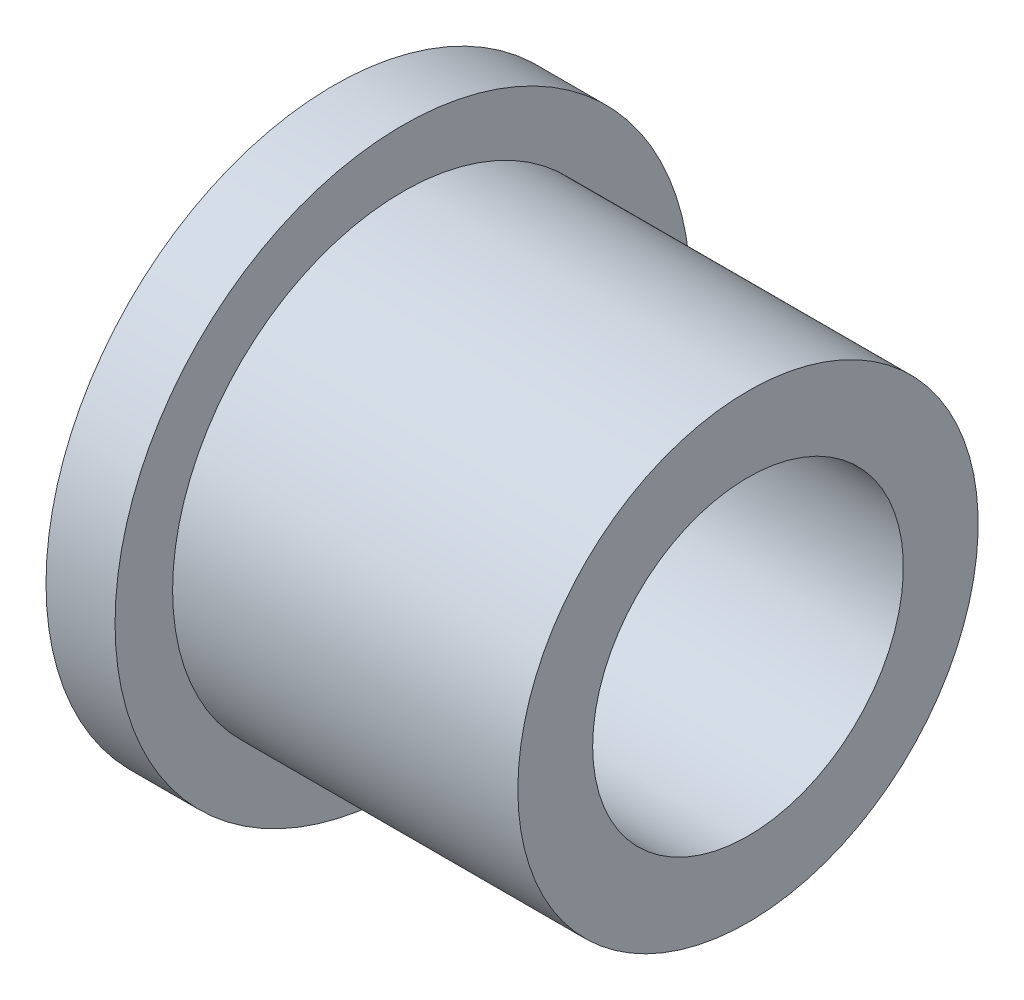
ISO-10303-21;
HEADER;
FILE_DESCRIPTION(('STEP AP214'),'2;1');
FILE_NAME('part.step','',(''),(''),'','','');
FILE_SCHEMA(('AUTOMOTIVE_DESIGN { 1 0 10303 214 1 1 1 1 }'));
ENDSEC;
DATA;
#1=APPLICATION_CONTEXT('core data for automotive mechanical design processes');
#2=APPLICATION_PROTOCOL_DEFINITION('international standard','automotive_design',2000,#1);
#3=PRODUCT_CONTEXT('',#1,'mechanical');
#4=PRODUCT('Part','Part','',(#3));
#5=PRODUCT_RELATED_PRODUCT_CATEGORY('part','',(#4));
#6=PRODUCT_DEFINITION_FORMATION('','',#4);
#7=PRODUCT_DEFINITION_CONTEXT('part definition',#1,'design');
#8=PRODUCT_DEFINITION('design','',#6,#7);
#9=PRODUCT_DEFINITION_SHAPE('','',#8);
#10=(LENGTH_UNIT() NAMED_UNIT(*) SI_UNIT(.MILLI.,.METRE.));
#11=(NAMED_UNIT(*) PLANE_ANGLE_UNIT() SI_UNIT($,.RADIAN.));
#12=(NAMED_UNIT(*) SI_UNIT($,.STERADIAN.) SOLID_ANGLE_UNIT());
#13=UNCERTAINTY_MEASURE_WITH_UNIT(LENGTH_MEASURE(1.E-05),#10,'distance_accuracy_value','');
#14=(GEOMETRIC_REPRESENTATION_CONTEXT(3) GLOBAL_UNCERTAINTY_ASSIGNED_CONTEXT((#13)) GLOBAL_UNIT_ASSIGNED_CONTEXT((#10,
#11,#12)) REPRESENTATION_CONTEXT('',''));
#15=CARTESIAN_POINT('',(0.,0.,0.));
#16=DIRECTION('',(0.,0.,1.));
#17=DIRECTION('',(1.,0.,0.));
#18=AXIS2_PLACEMENT_3D('',#15,#16,#17);
#19=CARTESIAN_POINT('',(-30.377027027027,0.,0.));
#20=DIRECTION('',(-1.,0.,0.));
#21=DIRECTION('',(0.,0.,1.));
#22=AXIS2_PLACEMENT_3D('',#19,#20,#21);
#23=CYLINDRICAL_SURFACE('',#22,8.5725);
#24=CARTESIAN_POINT('',(0.,0.,0.));
#25=DIRECTION('',(-1.,0.,0.));
#26=DIRECTION('',(0.,0.,1.));
#27=AXIS2_PLACEMENT_3D('',#24,#25,#26);
#28=CIRCLE('',#27,8.5725);
#29=CARTESIAN_POINT('',(0.,0.,8.5725));
#30=VERTEX_POINT('',#29);
#31=EDGE_CURVE('E10',#30,#30,#28,.T.);
#32=ORIENTED_EDGE('',*,*,#31,.F.);
#33=EDGE_LOOP('',(#32));
#34=FACE_BOUND('',#33,.T.);
#35=CARTESIAN_POINT('',(-22.86,0.,0.));
#36=DIRECTION('',(-1.,0.,0.));
#37=DIRECTION('',(0.,0.,1.));
#38=AXIS2_PLACEMENT_3D('',#35,#36,#37);
#39=CIRCLE('',#38,8.5725);
#40=CARTESIAN_POINT('',(-22.86,0.,8.5725));
#41=VERTEX_POINT('',#40);
#42=EDGE_CURVE('E68',#41,#41,#39,.T.);
#43=ORIENTED_EDGE('',*,*,#42,.T.);
#44=EDGE_LOOP('',(#43));
#45=FACE_BOUND('',#44,.T.);
#46=ADVANCED_FACE('F41',(#34,#45),#23,.F.);
#47=CARTESIAN_POINT('',(0.,8.5725,0.));
#48=DIRECTION('',(-1.,0.,0.));
#49=DIRECTION('',(0.,0.,1.));
#50=AXIS2_PLACEMENT_3D('',#47,#48,#49);
#51=PLANE('',#50);
#52=CARTESIAN_POINT('',(0.,0.,0.));
#53=DIRECTION('',(-1.,0.,0.));
#54=DIRECTION('',(0.,0.,1.));
#55=AXIS2_PLACEMENT_3D('',#52,#53,#54);
#56=CIRCLE('',#55,12.7);
#57=CARTESIAN_POINT('',(0.,0.,12.7));
#58=VERTEX_POINT('',#57);
#59=EDGE_CURVE('E48',#58,#58,#56,.T.);
#60=ORIENTED_EDGE('',*,*,#59,.F.);
#61=EDGE_LOOP('',(#60));
#62=FACE_BOUND('',#61,.T.);
#63=ORIENTED_EDGE('',*,*,#31,.T.);
#64=EDGE_LOOP('',(#63));
#65=FACE_BOUND('',#64,.T.);
#66=ADVANCED_FACE('F94',(#62,#65),#51,.F.);
#67=CARTESIAN_POINT('',(-30.377027027027,0.,0.));
#68=DIRECTION('',(-1.,0.,0.));
#69=DIRECTION('',(0.,0.,1.));
#70=AXIS2_PLACEMENT_3D('',#67,#68,#69);
#71=CYLINDRICAL_SURFACE('',#70,12.7);
#72=CARTESIAN_POINT('',(-19.05,0.,0.));
#73=DIRECTION('',(-1.,0.,0.));
#74=DIRECTION('',(0.,0.,1.));
#75=AXIS2_PLACEMENT_3D('',#72,#73,#74);
#76=CIRCLE('',#75,12.7);
#77=CARTESIAN_POINT('',(-19.05,0.,12.7));
#78=VERTEX_POINT('',#77);
#79=EDGE_CURVE('E53',#78,#78,#76,.T.);
#80=ORIENTED_EDGE('',*,*,#79,.F.);
#81=EDGE_LOOP('',(#80));
#82=FACE_BOUND('',#81,.T.);
#83=ORIENTED_EDGE('',*,*,#59,.T.);
#84=EDGE_LOOP('',(#83));
#85=FACE_BOUND('',#84,.T.);
#86=ADVANCED_FACE('F89',(#82,#85),#71,.T.);
#87=CARTESIAN_POINT('',(-19.05,12.7,0.));
#88=DIRECTION('',(-1.,0.,0.));
#89=DIRECTION('',(0.,0.,1.));
#90=AXIS2_PLACEMENT_3D('',#87,#88,#89);
#91=PLANE('',#90);
#92=CARTESIAN_POINT('',(-19.05,0.,0.));
#93=DIRECTION('',(-1.,0.,0.));
#94=DIRECTION('',(0.,0.,1.));
#95=AXIS2_PLACEMENT_3D('',#92,#93,#94);
#96=CIRCLE('',#95,15.875);
#97=CARTESIAN_POINT('',(-19.05,0.,15.875));
#98=VERTEX_POINT('',#97);
#99=EDGE_CURVE('E58',#98,#98,#96,.T.);
#100=ORIENTED_EDGE('',*,*,#99,.F.);
#101=EDGE_LOOP('',(#100));
#102=FACE_BOUND('',#101,.T.);
#103=ORIENTED_EDGE('',*,*,#79,.T.);
#104=EDGE_LOOP('',(#103));
#105=FACE_BOUND('',#104,.T.);
#106=ADVANCED_FACE('F83',(#102,#105),#91,.F.);
#107=CARTESIAN_POINT('',(-30.377027027027,0.,0.));
#108=DIRECTION('',(-1.,0.,0.));
#109=DIRECTION('',(0.,0.,1.));
#110=AXIS2_PLACEMENT_3D('',#107,#108,#109);
#111=CYLINDRICAL_SURFACE('',#110,15.875);
#112=CARTESIAN_POINT('',(-22.86,0.,0.));
#113=DIRECTION('',(-1.,0.,0.));
#114=DIRECTION('',(0.,0.,1.));
#115=AXIS2_PLACEMENT_3D('',#112,#113,#114);
#116=CIRCLE('',#115,15.875);
#117=CARTESIAN_POINT('',(-22.86,0.,15.875));
#118=VERTEX_POINT('',#117);
#119=EDGE_CURVE('E64',#118,#118,#116,.T.);
#120=ORIENTED_EDGE('',*,*,#119,.F.);
#121=EDGE_LOOP('',(#120));
#122=FACE_BOUND('',#121,.T.);
#123=ORIENTED_EDGE('',*,*,#99,.T.);
#124=EDGE_LOOP('',(#123));
#125=FACE_BOUND('',#124,.T.);
#126=ADVANCED_FACE('F77',(#122,#125),#111,.T.);
#127=CARTESIAN_POINT('',(-22.86,15.875,0.));
#128=DIRECTION('',(1.,0.,0.));
#129=DIRECTION('',(0.,0.,-1.));
#130=AXIS2_PLACEMENT_3D('',#127,#128,#129);
#131=PLANE('',#130);
#132=ORIENTED_EDGE('',*,*,#42,.F.);
#133=EDGE_LOOP('',(#132));
#134=FACE_BOUND('',#133,.T.);
#135=ORIENTED_EDGE('',*,*,#119,.T.);
#136=EDGE_LOOP('',(#135));
#137=FACE_BOUND('',#136,.T.);
#138=ADVANCED_FACE('F74',(#134,#137),#131,.F.);
#139=CLOSED_SHELL('',(#46,#66,#86,#106,#126,#138));
#140=MANIFOLD_SOLID_BREP('B2',#139);
#141=ADVANCED_BREP_SHAPE_REPRESENTATION('',(#18,#140),#14);
#142=SHAPE_DEFINITION_REPRESENTATION(#9,#141);
ENDSEC;
END-ISO-10303-21;
